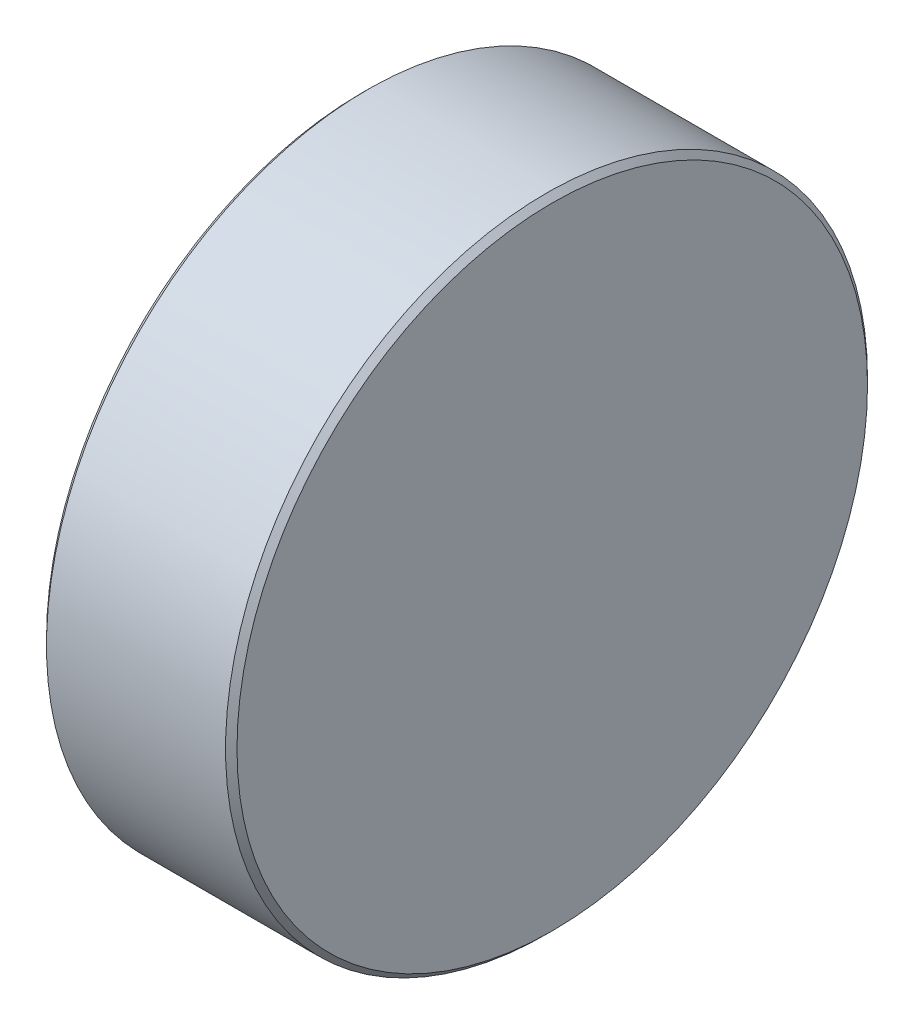
ISO-10303-21;
HEADER;
FILE_DESCRIPTION(('STEP AP214'),'2;1');
FILE_NAME('part.step','',(''),(''),'','','');
FILE_SCHEMA(('AUTOMOTIVE_DESIGN { 1 0 10303 214 1 1 1 1 }'));
ENDSEC;
DATA;
#1=APPLICATION_CONTEXT('core data for automotive mechanical design processes');
#2=APPLICATION_PROTOCOL_DEFINITION('international standard','automotive_design',2000,#1);
#3=PRODUCT_CONTEXT('',#1,'mechanical');
#4=PRODUCT('Part','Part','',(#3));
#5=PRODUCT_RELATED_PRODUCT_CATEGORY('part','',(#4));
#6=PRODUCT_DEFINITION_FORMATION('','',#4);
#7=PRODUCT_DEFINITION_CONTEXT('part definition',#1,'design');
#8=PRODUCT_DEFINITION('design','',#6,#7);
#9=PRODUCT_DEFINITION_SHAPE('','',#8);
#10=(LENGTH_UNIT() NAMED_UNIT(*) SI_UNIT(.MILLI.,.METRE.));
#11=(NAMED_UNIT(*) PLANE_ANGLE_UNIT() SI_UNIT($,.RADIAN.));
#12=(NAMED_UNIT(*) SI_UNIT($,.STERADIAN.) SOLID_ANGLE_UNIT());
#13=UNCERTAINTY_MEASURE_WITH_UNIT(LENGTH_MEASURE(1.E-05),#10,'distance_accuracy_value','');
#14=(GEOMETRIC_REPRESENTATION_CONTEXT(3) GLOBAL_UNCERTAINTY_ASSIGNED_CONTEXT((#13)) GLOBAL_UNIT_ASSIGNED_CONTEXT((#10,
#11,#12)) REPRESENTATION_CONTEXT('',''));
#15=CARTESIAN_POINT('',(0.,0.,0.));
#16=DIRECTION('',(0.,0.,1.));
#17=DIRECTION('',(1.,0.,0.));
#18=AXIS2_PLACEMENT_3D('',#15,#16,#17);
#19=CARTESIAN_POINT('',(10.,0.,0.));
#20=DIRECTION('',(-1.,0.,0.));
#21=DIRECTION('',(0.,0.,1.));
#22=AXIS2_PLACEMENT_3D('',#19,#20,#21);
#23=CYLINDRICAL_SURFACE('',#22,16.85);
#24=CARTESIAN_POINT('',(0.299999999999995,0.,0.));
#25=DIRECTION('',(1.,0.,0.));
#26=DIRECTION('',(0.,0.,-1.));
#27=AXIS2_PLACEMENT_3D('',#24,#25,#26);
#28=CIRCLE('',#27,16.85);
#29=CARTESIAN_POINT('',(0.299999999999995,0.,-16.85));
#30=VERTEX_POINT('',#29);
#31=EDGE_CURVE('E62',#30,#30,#28,.T.);
#32=ORIENTED_EDGE('',*,*,#31,.T.);
#33=EDGE_LOOP('',(#32));
#34=FACE_BOUND('',#33,.T.);
#35=CARTESIAN_POINT('',(9.69999999999999,0.,0.));
#36=DIRECTION('',(1.,0.,0.));
#37=DIRECTION('',(0.,0.,-1.));
#38=AXIS2_PLACEMENT_3D('',#35,#36,#37);
#39=CIRCLE('',#38,16.85);
#40=CARTESIAN_POINT('',(9.69999999999999,0.,-16.85));
#41=VERTEX_POINT('',#40);
#42=EDGE_CURVE('E66',#41,#41,#39,.F.);
#43=ORIENTED_EDGE('',*,*,#42,.T.);
#44=EDGE_LOOP('',(#43));
#45=FACE_BOUND('',#44,.T.);
#46=ADVANCED_FACE('F47',(#34,#45),#23,.T.);
#47=CARTESIAN_POINT('',(10.,0.,0.));
#48=DIRECTION('',(1.,0.,0.));
#49=DIRECTION('',(0.,0.,-1.));
#50=AXIS2_PLACEMENT_3D('',#47,#48,#49);
#51=PLANE('',#50);
#52=CARTESIAN_POINT('',(10.,0.,0.));
#53=DIRECTION('',(1.,0.,0.));
#54=DIRECTION('',(0.,0.,-1.));
#55=AXIS2_PLACEMENT_3D('',#52,#53,#54);
#56=CIRCLE('',#55,16.55);
#57=CARTESIAN_POINT('',(10.,0.,-16.55));
#58=VERTEX_POINT('',#57);
#59=EDGE_CURVE('E10',#58,#58,#56,.T.);
#60=ORIENTED_EDGE('',*,*,#59,.T.);
#61=EDGE_LOOP('',(#60));
#62=FACE_BOUND('',#61,.T.);
#63=ADVANCED_FACE('F82',(#62),#51,.T.);
#64=CARTESIAN_POINT('',(0.,0.,0.));
#65=DIRECTION('',(1.,0.,0.));
#66=DIRECTION('',(0.,0.,-1.));
#67=AXIS2_PLACEMENT_3D('',#64,#65,#66);
#68=PLANE('',#67);
#69=CARTESIAN_POINT('',(0.,0.,0.));
#70=DIRECTION('',(1.,0.,0.));
#71=DIRECTION('',(0.,0.,-1.));
#72=AXIS2_PLACEMENT_3D('',#69,#70,#71);
#73=CIRCLE('',#72,16.55);
#74=CARTESIAN_POINT('',(0.,0.,-16.55));
#75=VERTEX_POINT('',#74);
#76=EDGE_CURVE('E56',#75,#75,#73,.F.);
#77=ORIENTED_EDGE('',*,*,#76,.T.);
#78=EDGE_LOOP('',(#77));
#79=FACE_BOUND('',#78,.T.);
#80=ADVANCED_FACE('F79',(#79),#68,.F.);
#81=CARTESIAN_POINT('',(0.299999999999995,0.,0.));
#82=DIRECTION('',(1.,0.,0.));
#83=DIRECTION('',(0.,0.,-1.));
#84=AXIS2_PLACEMENT_3D('',#81,#82,#83);
#85=CONICAL_SURFACE('',#84,16.85,0.785398163397454);
#86=ORIENTED_EDGE('',*,*,#76,.F.);
#87=EDGE_LOOP('',(#86));
#88=FACE_BOUND('',#87,.T.);
#89=ORIENTED_EDGE('',*,*,#31,.F.);
#90=EDGE_LOOP('',(#89));
#91=FACE_BOUND('',#90,.T.);
#92=ADVANCED_FACE('F76',(#88,#91),#85,.T.);
#93=CARTESIAN_POINT('',(10.,0.,0.));
#94=DIRECTION('',(-1.,0.,0.));
#95=DIRECTION('',(0.,0.,1.));
#96=AXIS2_PLACEMENT_3D('',#93,#94,#95);
#97=CONICAL_SURFACE('',#96,16.55,0.785398163397448);
#98=ORIENTED_EDGE('',*,*,#42,.F.);
#99=EDGE_LOOP('',(#98));
#100=FACE_BOUND('',#99,.T.);
#101=ORIENTED_EDGE('',*,*,#59,.F.);
#102=EDGE_LOOP('',(#101));
#103=FACE_BOUND('',#102,.T.);
#104=ADVANCED_FACE('F50',(#100,#103),#97,.T.);
#105=CLOSED_SHELL('',(#46,#63,#80,#92,#104));
#106=MANIFOLD_SOLID_BREP('B2',#105);
#107=ADVANCED_BREP_SHAPE_REPRESENTATION('',(#18,#106),#14);
#108=SHAPE_DEFINITION_REPRESENTATION(#9,#107);
ENDSEC;
END-ISO-10303-21;
